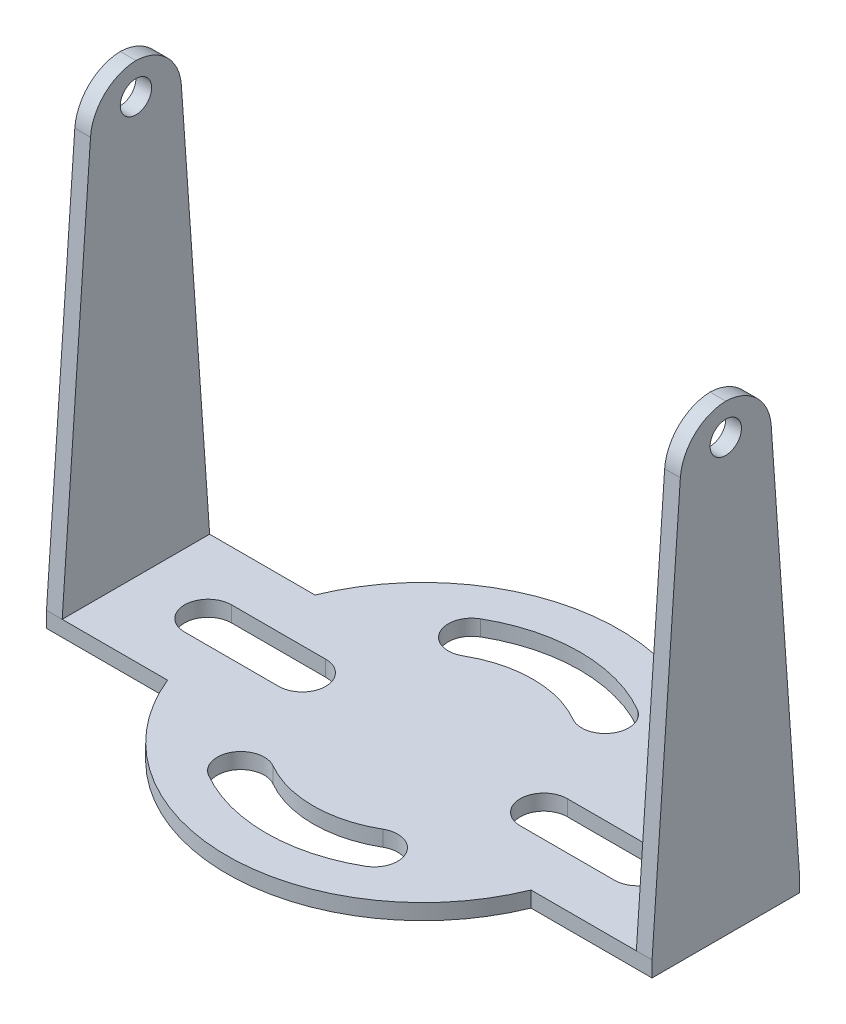
ISO-10303-21;
HEADER;
FILE_DESCRIPTION(('STEP AP214'),'2;1');
FILE_NAME('part.step','',(''),(''),'','','');
FILE_SCHEMA(('AUTOMOTIVE_DESIGN { 1 0 10303 214 1 1 1 1 }'));
ENDSEC;
DATA;
#1=APPLICATION_CONTEXT('core data for automotive mechanical design processes');
#2=APPLICATION_PROTOCOL_DEFINITION('international standard','automotive_design',2000,#1);
#3=PRODUCT_CONTEXT('',#1,'mechanical');
#4=PRODUCT('Part','Part','',(#3));
#5=PRODUCT_RELATED_PRODUCT_CATEGORY('part','',(#4));
#6=PRODUCT_DEFINITION_FORMATION('','',#4);
#7=PRODUCT_DEFINITION_CONTEXT('part definition',#1,'design');
#8=PRODUCT_DEFINITION('design','',#6,#7);
#9=PRODUCT_DEFINITION_SHAPE('','',#8);
#10=(LENGTH_UNIT() NAMED_UNIT(*) SI_UNIT(.MILLI.,.METRE.));
#11=(NAMED_UNIT(*) PLANE_ANGLE_UNIT() SI_UNIT($,.RADIAN.));
#12=(NAMED_UNIT(*) SI_UNIT($,.STERADIAN.) SOLID_ANGLE_UNIT());
#13=UNCERTAINTY_MEASURE_WITH_UNIT(LENGTH_MEASURE(1.E-05),#10,'distance_accuracy_value','');
#14=(GEOMETRIC_REPRESENTATION_CONTEXT(3) GLOBAL_UNCERTAINTY_ASSIGNED_CONTEXT((#13)) GLOBAL_UNIT_ASSIGNED_CONTEXT((#10,
#11,#12)) REPRESENTATION_CONTEXT('',''));
#15=CARTESIAN_POINT('',(0.,0.,0.));
#16=DIRECTION('',(0.,0.,1.));
#17=DIRECTION('',(1.,0.,0.));
#18=AXIS2_PLACEMENT_3D('',#15,#16,#17);
#19=CARTESIAN_POINT('',(19.3,1.,-4.7));
#20=DIRECTION('',(0.,0.,1.));
#21=DIRECTION('',(1.,0.,0.));
#22=AXIS2_PLACEMENT_3D('',#19,#20,#21);
#23=PLANE('',#22);
#24=DIRECTION('',(1.,0.,0.));
#25=VECTOR('',#24,1.);
#26=CARTESIAN_POINT('',(-19.3,0.999999999999998,-4.7));
#27=LINE('',#26,#25);
#28=CARTESIAN_POINT('',(18.3,0.999999999999998,-4.7));
#29=VERTEX_POINT('',#28);
#30=CARTESIAN_POINT('',(19.3,0.999999999999998,-4.7));
#31=VERTEX_POINT('',#30);
#32=EDGE_CURVE('E250',#29,#31,#27,.T.);
#33=ORIENTED_EDGE('',*,*,#32,.T.);
#34=DIRECTION('',(0.,-1.,0.));
#35=VECTOR('',#34,1.);
#36=CARTESIAN_POINT('',(19.3,1.,-4.7));
#37=LINE('',#36,#35);
#38=CARTESIAN_POINT('',(19.3,0.,-4.7));
#39=VERTEX_POINT('',#38);
#40=EDGE_CURVE('E262',#31,#39,#37,.T.);
#41=ORIENTED_EDGE('',*,*,#40,.T.);
#42=DIRECTION('',(-1.,0.,0.));
#43=VECTOR('',#42,1.);
#44=CARTESIAN_POINT('',(19.3,0.,-4.7));
#45=LINE('',#44,#43);
#46=CARTESIAN_POINT('',(11.5827457884562,0.,-4.7));
#47=VERTEX_POINT('',#46);
#48=EDGE_CURVE('E503',#39,#47,#45,.T.);
#49=ORIENTED_EDGE('',*,*,#48,.T.);
#50=DIRECTION('',(0.,1.,0.));
#51=VECTOR('',#50,1.);
#52=CARTESIAN_POINT('',(11.5827457884562,0.,-4.7));
#53=LINE('',#52,#51);
#54=CARTESIAN_POINT('',(11.5827457884562,1.,-4.7));
#55=VERTEX_POINT('',#54);
#56=EDGE_CURVE('E475',#47,#55,#53,.T.);
#57=ORIENTED_EDGE('',*,*,#56,.T.);
#58=DIRECTION('',(-1.,0.,0.));
#59=VECTOR('',#58,1.);
#60=CARTESIAN_POINT('',(19.3,1.,-4.7));
#61=LINE('',#60,#59);
#62=EDGE_CURVE('E266',#29,#55,#61,.T.);
#63=ORIENTED_EDGE('',*,*,#62,.F.);
#64=EDGE_LOOP('',(#33,#41,#49,#57,#63));
#65=FACE_BOUND('',#64,.T.);
#66=ADVANCED_FACE('F36',(#65),#23,.F.);
#67=CARTESIAN_POINT('',(-19.3,1.,4.7));
#68=DIRECTION('',(1.,0.,0.));
#69=DIRECTION('',(0.,0.,-1.));
#70=AXIS2_PLACEMENT_3D('',#67,#68,#69);
#71=PLANE('',#70);
#72=CARTESIAN_POINT('',(-19.3,27.5,0.));
#73=DIRECTION('',(1.,0.,0.));
#74=DIRECTION('',(0.,0.,-1.));
#75=AXIS2_PLACEMENT_3D('',#72,#73,#74);
#76=CIRCLE('',#75,1.);
#77=CARTESIAN_POINT('',(-19.3,27.5,-1.));
#78=VERTEX_POINT('',#77);
#79=EDGE_CURVE('E287',#78,#78,#76,.T.);
#80=ORIENTED_EDGE('',*,*,#79,.T.);
#81=EDGE_LOOP('',(#80));
#82=FACE_BOUND('',#81,.T.);
#83=CARTESIAN_POINT('',(-19.3,26.5,-0.0968515004550874));
#84=DIRECTION('',(1.,0.,0.));
#85=DIRECTION('',(0.,0.,-1.));
#86=AXIS2_PLACEMENT_3D('',#83,#84,#85);
#87=CIRCLE('',#86,3.);
#88=CARTESIAN_POINT('',(-19.3,26.7100098444422,2.89578878284616));
#89=VERTEX_POINT('',#88);
#90=CARTESIAN_POINT('',(-19.3,29.4984362235772,0.));
#91=VERTEX_POINT('',#90);
#92=EDGE_CURVE('E294',#89,#91,#87,.F.);
#93=ORIENTED_EDGE('',*,*,#92,.T.);
#94=CARTESIAN_POINT('',(-19.3,26.5,0.0968515004550873));
#95=DIRECTION('',(1.,0.,0.));
#96=DIRECTION('',(0.,0.,-1.));
#97=AXIS2_PLACEMENT_3D('',#94,#95,#96);
#98=CIRCLE('',#97,3.);
#99=CARTESIAN_POINT('',(-19.3,26.7100098444422,-2.89578878284616));
#100=VERTEX_POINT('',#99);
#101=EDGE_CURVE('E296',#91,#100,#98,.F.);
#102=ORIENTED_EDGE('',*,*,#101,.T.);
#103=DIRECTION('',(0.,0.997546761100416,0.0700032814807309));
#104=VECTOR('',#103,1.);
#105=CARTESIAN_POINT('',(-19.3,0.999999999999998,-4.7));
#106=LINE('',#105,#104);
#107=CARTESIAN_POINT('',(-19.3,0.999999999999998,-4.7));
#108=VERTEX_POINT('',#107);
#109=EDGE_CURVE('E257',#108,#100,#106,.T.);
#110=ORIENTED_EDGE('',*,*,#109,.F.);
#111=DIRECTION('',(0.,-1.,0.));
#112=VECTOR('',#111,1.);
#113=CARTESIAN_POINT('',(-19.3,1.,-4.7));
#114=LINE('',#113,#112);
#115=CARTESIAN_POINT('',(-19.3,0.,-4.7));
#116=VERTEX_POINT('',#115);
#117=EDGE_CURVE('E275',#108,#116,#114,.T.);
#118=ORIENTED_EDGE('',*,*,#117,.T.);
#119=DIRECTION('',(0.,0.,1.));
#120=VECTOR('',#119,1.);
#121=CARTESIAN_POINT('',(-19.3,0.,4.7));
#122=LINE('',#121,#120);
#123=CARTESIAN_POINT('',(-19.3,0.,4.7));
#124=VERTEX_POINT('',#123);
#125=EDGE_CURVE('E489',#116,#124,#122,.T.);
#126=ORIENTED_EDGE('',*,*,#125,.T.);
#127=DIRECTION('',(0.,-1.,0.));
#128=VECTOR('',#127,1.);
#129=CARTESIAN_POINT('',(-19.3,1.,4.7));
#130=LINE('',#129,#128);
#131=CARTESIAN_POINT('',(-19.3,0.999999999999998,4.7));
#132=VERTEX_POINT('',#131);
#133=EDGE_CURVE('E277',#132,#124,#130,.T.);
#134=ORIENTED_EDGE('',*,*,#133,.F.);
#135=DIRECTION('',(0.,0.997546761100416,-0.070003281480731));
#136=VECTOR('',#135,1.);
#137=CARTESIAN_POINT('',(-19.3,0.333108728943338,4.74679938744257));
#138=LINE('',#137,#136);
#139=EDGE_CURVE('E326',#132,#89,#138,.T.);
#140=ORIENTED_EDGE('',*,*,#139,.T.);
#141=EDGE_LOOP('',(#93,#102,#110,#118,#126,#134,#140));
#142=FACE_BOUND('',#141,.T.);
#143=ADVANCED_FACE('F522',(#82,#142),#71,.F.);
#144=CARTESIAN_POINT('',(19.3,1.,4.7));
#145=DIRECTION('',(-1.,0.,0.));
#146=DIRECTION('',(0.,0.,1.));
#147=AXIS2_PLACEMENT_3D('',#144,#145,#146);
#148=PLANE('',#147);
#149=CARTESIAN_POINT('',(19.3,27.5,0.));
#150=DIRECTION('',(1.,0.,0.));
#151=DIRECTION('',(0.,0.,-1.));
#152=AXIS2_PLACEMENT_3D('',#149,#150,#151);
#153=CIRCLE('',#152,1.);
#154=CARTESIAN_POINT('',(19.3,27.5,-1.));
#155=VERTEX_POINT('',#154);
#156=EDGE_CURVE('E308',#155,#155,#153,.T.);
#157=ORIENTED_EDGE('',*,*,#156,.F.);
#158=EDGE_LOOP('',(#157));
#159=FACE_BOUND('',#158,.T.);
#160=DIRECTION('',(0.,0.997546761100416,0.0700032814807309));
#161=VECTOR('',#160,1.);
#162=CARTESIAN_POINT('',(19.3,0.999999999999998,-4.7));
#163=LINE('',#162,#161);
#164=CARTESIAN_POINT('',(19.3,26.7100098444422,-2.89578878284616));
#165=VERTEX_POINT('',#164);
#166=EDGE_CURVE('E246',#31,#165,#163,.T.);
#167=ORIENTED_EDGE('',*,*,#166,.T.);
#168=CARTESIAN_POINT('',(19.3,26.5,0.0968515004550873));
#169=DIRECTION('',(-1.,0.,0.));
#170=DIRECTION('',(0.,0.,1.));
#171=AXIS2_PLACEMENT_3D('',#168,#169,#170);
#172=CIRCLE('',#171,3.);
#173=CARTESIAN_POINT('',(19.3,29.4984362235772,0.));
#174=VERTEX_POINT('',#173);
#175=EDGE_CURVE('E303',#165,#174,#172,.F.);
#176=ORIENTED_EDGE('',*,*,#175,.T.);
#177=CARTESIAN_POINT('',(19.3,26.5,-0.0968515004550874));
#178=DIRECTION('',(-1.,0.,0.));
#179=DIRECTION('',(0.,0.,1.));
#180=AXIS2_PLACEMENT_3D('',#177,#178,#179);
#181=CIRCLE('',#180,3.);
#182=CARTESIAN_POINT('',(19.3,26.7100098444422,2.89578878284616));
#183=VERTEX_POINT('',#182);
#184=EDGE_CURVE('E301',#174,#183,#181,.F.);
#185=ORIENTED_EDGE('',*,*,#184,.T.);
#186=DIRECTION('',(0.,0.997546761100416,-0.070003281480731));
#187=VECTOR('',#186,1.);
#188=CARTESIAN_POINT('',(19.3,0.333108728943338,4.74679938744257));
#189=LINE('',#188,#187);
#190=CARTESIAN_POINT('',(19.3,0.999999999999998,4.7));
#191=VERTEX_POINT('',#190);
#192=EDGE_CURVE('E321',#191,#183,#189,.T.);
#193=ORIENTED_EDGE('',*,*,#192,.F.);
#194=DIRECTION('',(0.,-1.,0.));
#195=VECTOR('',#194,1.);
#196=CARTESIAN_POINT('',(19.3,1.,4.7));
#197=LINE('',#196,#195);
#198=CARTESIAN_POINT('',(19.3,0.,4.7));
#199=VERTEX_POINT('',#198);
#200=EDGE_CURVE('E274',#191,#199,#197,.T.);
#201=ORIENTED_EDGE('',*,*,#200,.T.);
#202=DIRECTION('',(0.,0.,-1.));
#203=VECTOR('',#202,1.);
#204=CARTESIAN_POINT('',(19.3,0.,4.7));
#205=LINE('',#204,#203);
#206=EDGE_CURVE('E272',#199,#39,#205,.T.);
#207=ORIENTED_EDGE('',*,*,#206,.T.);
#208=ORIENTED_EDGE('',*,*,#40,.F.);
#209=EDGE_LOOP('',(#167,#176,#185,#193,#201,#207,#208));
#210=FACE_BOUND('',#209,.T.);
#211=ADVANCED_FACE('F270',(#159,#210),#148,.F.);
#212=CARTESIAN_POINT('',(-18.3,0.999999999999998,-4.7));
#213=VERTEX_POINT('',#212);
#214=EDGE_CURVE('E267',#108,#213,#27,.T.);
#215=ORIENTED_EDGE('',*,*,#214,.T.);
#216=CARTESIAN_POINT('',(-11.5827457884562,1.,-4.7));
#217=VERTEX_POINT('',#216);
#218=EDGE_CURVE('E493',#217,#213,#61,.T.);
#219=ORIENTED_EDGE('',*,*,#218,.F.);
#220=DIRECTION('',(0.,1.,0.));
#221=VECTOR('',#220,1.);
#222=CARTESIAN_POINT('',(-11.5827457884562,0.,-4.7));
#223=LINE('',#222,#221);
#224=CARTESIAN_POINT('',(-11.5827457884562,0.,-4.7));
#225=VERTEX_POINT('',#224);
#226=EDGE_CURVE('E457',#217,#225,#223,.F.);
#227=ORIENTED_EDGE('',*,*,#226,.T.);
#228=EDGE_CURVE('E502',#225,#116,#45,.T.);
#229=ORIENTED_EDGE('',*,*,#228,.T.);
#230=ORIENTED_EDGE('',*,*,#117,.F.);
#231=EDGE_LOOP('',(#215,#219,#227,#229,#230));
#232=FACE_BOUND('',#231,.T.);
#233=ADVANCED_FACE('F511',(#232),#23,.F.);
#234=CARTESIAN_POINT('',(-18.3,29.5,-4.7));
#235=DIRECTION('',(-1.,0.,0.));
#236=DIRECTION('',(0.,0.,1.));
#237=AXIS2_PLACEMENT_3D('',#234,#235,#236);
#238=PLANE('',#237);
#239=CARTESIAN_POINT('',(-18.3,27.5,0.));
#240=DIRECTION('',(-1.,0.,0.));
#241=DIRECTION('',(0.,0.,1.));
#242=AXIS2_PLACEMENT_3D('',#239,#240,#241);
#243=CIRCLE('',#242,1.);
#244=CARTESIAN_POINT('',(-18.3,27.5,1.));
#245=VERTEX_POINT('',#244);
#246=EDGE_CURVE('E268',#245,#245,#243,.T.);
#247=ORIENTED_EDGE('',*,*,#246,.T.);
#248=EDGE_LOOP('',(#247));
#249=FACE_BOUND('',#248,.T.);
#250=DIRECTION('',(0.,-0.997546761100416,-0.0700032814807309));
#251=VECTOR('',#250,1.);
#252=CARTESIAN_POINT('',(-18.3,29.360336906585,-2.70980091883614));
#253=LINE('',#252,#251);
#254=CARTESIAN_POINT('',(-18.3,26.7100098444422,-2.89578878284616));
#255=VERTEX_POINT('',#254);
#256=EDGE_CURVE('E327',#255,#213,#253,.T.);
#257=ORIENTED_EDGE('',*,*,#256,.F.);
#258=CARTESIAN_POINT('',(-18.3,26.5,0.0968515004550873));
#259=DIRECTION('',(-1.,0.,0.));
#260=DIRECTION('',(0.,0.,1.));
#261=AXIS2_PLACEMENT_3D('',#258,#259,#260);
#262=CIRCLE('',#261,3.);
#263=CARTESIAN_POINT('',(-18.3,29.4984362235772,0.));
#264=VERTEX_POINT('',#263);
#265=EDGE_CURVE('E292',#255,#264,#262,.F.);
#266=ORIENTED_EDGE('',*,*,#265,.T.);
#267=CARTESIAN_POINT('',(-18.3,26.5,-0.0968515004550874));
#268=DIRECTION('',(-1.,0.,0.));
#269=DIRECTION('',(0.,0.,1.));
#270=AXIS2_PLACEMENT_3D('',#267,#268,#269);
#271=CIRCLE('',#270,3.);
#272=CARTESIAN_POINT('',(-18.3,26.7100098444422,2.89578878284616));
#273=VERTEX_POINT('',#272);
#274=EDGE_CURVE('E290',#264,#273,#271,.F.);
#275=ORIENTED_EDGE('',*,*,#274,.T.);
#276=DIRECTION('',(0.,-0.997546761100416,0.0700032814807309));
#277=VECTOR('',#276,1.);
#278=CARTESIAN_POINT('',(-18.3,30.0167534456355,2.66373660030628));
#279=LINE('',#278,#277);
#280=CARTESIAN_POINT('',(-18.3,0.999999999999998,4.7));
#281=VERTEX_POINT('',#280);
#282=EDGE_CURVE('E338',#273,#281,#279,.T.);
#283=ORIENTED_EDGE('',*,*,#282,.T.);
#284=DIRECTION('',(0.,0.,-1.));
#285=VECTOR('',#284,1.);
#286=CARTESIAN_POINT('',(-18.3,1.,-4.7));
#287=LINE('',#286,#285);
#288=EDGE_CURVE('E486',#281,#213,#287,.T.);
#289=ORIENTED_EDGE('',*,*,#288,.T.);
#290=EDGE_LOOP('',(#257,#266,#275,#283,#289));
#291=FACE_BOUND('',#290,.T.);
#292=ADVANCED_FACE('F547',(#249,#291),#238,.F.);
#293=CARTESIAN_POINT('',(18.3,29.5,-4.7));
#294=DIRECTION('',(1.,0.,0.));
#295=DIRECTION('',(0.,0.,-1.));
#296=AXIS2_PLACEMENT_3D('',#293,#294,#295);
#297=PLANE('',#296);
#298=CARTESIAN_POINT('',(18.3,27.5,0.));
#299=DIRECTION('',(1.,0.,0.));
#300=DIRECTION('',(0.,0.,-1.));
#301=AXIS2_PLACEMENT_3D('',#298,#299,#300);
#302=CIRCLE('',#301,1.);
#303=CARTESIAN_POINT('',(18.3,27.5,-1.));
#304=VERTEX_POINT('',#303);
#305=EDGE_CURVE('E284',#304,#304,#302,.T.);
#306=ORIENTED_EDGE('',*,*,#305,.T.);
#307=EDGE_LOOP('',(#306));
#308=FACE_BOUND('',#307,.T.);
#309=CARTESIAN_POINT('',(18.3,26.5,-0.0968515004550874));
#310=DIRECTION('',(1.,0.,0.));
#311=DIRECTION('',(0.,0.,-1.));
#312=AXIS2_PLACEMENT_3D('',#309,#310,#311);
#313=CIRCLE('',#312,3.);
#314=CARTESIAN_POINT('',(18.3,26.7100098444422,2.89578878284616));
#315=VERTEX_POINT('',#314);
#316=CARTESIAN_POINT('',(18.3,29.4984362235772,0.));
#317=VERTEX_POINT('',#316);
#318=EDGE_CURVE('E53',#315,#317,#313,.F.);
#319=ORIENTED_EDGE('',*,*,#318,.T.);
#320=CARTESIAN_POINT('',(18.3,26.5,0.0968515004550873));
#321=DIRECTION('',(1.,0.,0.));
#322=DIRECTION('',(0.,0.,-1.));
#323=AXIS2_PLACEMENT_3D('',#320,#321,#322);
#324=CIRCLE('',#323,3.);
#325=CARTESIAN_POINT('',(18.3,26.7100098444422,-2.89578878284616));
#326=VERTEX_POINT('',#325);
#327=EDGE_CURVE('E45',#317,#326,#324,.F.);
#328=ORIENTED_EDGE('',*,*,#327,.T.);
#329=DIRECTION('',(0.,0.997546761100416,0.0700032814807309));
#330=VECTOR('',#329,1.);
#331=CARTESIAN_POINT('',(18.3,29.360336906585,-2.70980091883614));
#332=LINE('',#331,#330);
#333=EDGE_CURVE('E256',#29,#326,#332,.T.);
#334=ORIENTED_EDGE('',*,*,#333,.F.);
#335=DIRECTION('',(0.,0.,1.));
#336=VECTOR('',#335,1.);
#337=CARTESIAN_POINT('',(18.3,1.,-4.7));
#338=LINE('',#337,#336);
#339=CARTESIAN_POINT('',(18.3,0.999999999999998,4.7));
#340=VERTEX_POINT('',#339);
#341=EDGE_CURVE('E483',#29,#340,#338,.T.);
#342=ORIENTED_EDGE('',*,*,#341,.T.);
#343=DIRECTION('',(0.,0.997546761100416,-0.0700032814807309));
#344=VECTOR('',#343,1.);
#345=CARTESIAN_POINT('',(18.3,30.0167534456355,2.66373660030628));
#346=LINE('',#345,#344);
#347=EDGE_CURVE('E336',#340,#315,#346,.T.);
#348=ORIENTED_EDGE('',*,*,#347,.T.);
#349=EDGE_LOOP('',(#319,#328,#334,#342,#348));
#350=FACE_BOUND('',#349,.T.);
#351=ADVANCED_FACE('F530',(#308,#350),#297,.F.);
#352=CARTESIAN_POINT('',(19.3,1.,4.7));
#353=DIRECTION('',(0.,0.,-1.));
#354=DIRECTION('',(-1.,0.,0.));
#355=AXIS2_PLACEMENT_3D('',#352,#353,#354);
#356=PLANE('',#355);
#357=DIRECTION('',(1.,0.,0.));
#358=VECTOR('',#357,1.);
#359=CARTESIAN_POINT('',(19.3,1.,4.7));
#360=LINE('',#359,#358);
#361=CARTESIAN_POINT('',(-11.5827457884562,1.,4.7));
#362=VERTEX_POINT('',#361);
#363=EDGE_CURVE('E490',#281,#362,#360,.T.);
#364=ORIENTED_EDGE('',*,*,#363,.F.);
#365=DIRECTION('',(1.,0.,0.));
#366=VECTOR('',#365,1.);
#367=CARTESIAN_POINT('',(-19.3,0.999999999999998,4.7));
#368=LINE('',#367,#366);
#369=EDGE_CURVE('E333',#132,#281,#368,.T.);
#370=ORIENTED_EDGE('',*,*,#369,.F.);
#371=ORIENTED_EDGE('',*,*,#133,.T.);
#372=DIRECTION('',(1.,0.,0.));
#373=VECTOR('',#372,1.);
#374=CARTESIAN_POINT('',(19.3,0.,4.7));
#375=LINE('',#374,#373);
#376=CARTESIAN_POINT('',(-11.5827457884562,0.,4.7));
#377=VERTEX_POINT('',#376);
#378=EDGE_CURVE('E499',#124,#377,#375,.T.);
#379=ORIENTED_EDGE('',*,*,#378,.T.);
#380=DIRECTION('',(0.,1.,0.));
#381=VECTOR('',#380,1.);
#382=CARTESIAN_POINT('',(-11.5827457884562,0.,4.7));
#383=LINE('',#382,#381);
#384=EDGE_CURVE('E480',#377,#362,#383,.T.);
#385=ORIENTED_EDGE('',*,*,#384,.T.);
#386=EDGE_LOOP('',(#364,#370,#371,#379,#385));
#387=FACE_BOUND('',#386,.T.);
#388=ADVANCED_FACE('F555',(#387),#356,.F.);
#389=CARTESIAN_POINT('',(0.,1.,0.));
#390=DIRECTION('',(0.,1.,0.));
#391=DIRECTION('',(0.,0.,1.));
#392=AXIS2_PLACEMENT_3D('',#389,#390,#391);
#393=PLANE('',#392);
#394=CARTESIAN_POINT('',(0.,1.,0.));
#395=DIRECTION('',(0.,1.,0.));
#396=DIRECTION('',(0.,0.,1.));
#397=AXIS2_PLACEMENT_3D('',#394,#395,#396);
#398=CIRCLE('',#397,12.5);
#399=EDGE_CURVE('E443',#55,#217,#398,.T.);
#400=ORIENTED_EDGE('',*,*,#399,.T.);
#401=ORIENTED_EDGE('',*,*,#218,.T.);
#402=ORIENTED_EDGE('',*,*,#288,.F.);
#403=ORIENTED_EDGE('',*,*,#363,.T.);
#404=CARTESIAN_POINT('',(11.5827457884562,1.,4.7));
#405=VERTEX_POINT('',#404);
#406=EDGE_CURVE('E441',#362,#405,#398,.T.);
#407=ORIENTED_EDGE('',*,*,#406,.T.);
#408=EDGE_CURVE('E494',#405,#340,#360,.T.);
#409=ORIENTED_EDGE('',*,*,#408,.T.);
#410=ORIENTED_EDGE('',*,*,#341,.F.);
#411=ORIENTED_EDGE('',*,*,#62,.T.);
#412=EDGE_LOOP('',(#400,#401,#402,#403,#407,#409,#410,#411));
#413=FACE_BOUND('',#412,.T.);
#414=CARTESIAN_POINT('',(4.24999999999996,1.,-7.36121593216775));
#415=DIRECTION('',(0.,1.,0.));
#416=DIRECTION('',(0.,0.,1.));
#417=AXIS2_PLACEMENT_3D('',#414,#415,#416);
#418=CIRCLE('',#417,1.5);
#419=CARTESIAN_POINT('',(3.49999999999997,1.,-6.06217782649109));
#420=VERTEX_POINT('',#419);
#421=CARTESIAN_POINT('',(4.99999999999995,1.,-8.66025403784442));
#422=VERTEX_POINT('',#421);
#423=EDGE_CURVE('E398',#420,#422,#418,.T.);
#424=ORIENTED_EDGE('',*,*,#423,.F.);
#425=CARTESIAN_POINT('',(0.,1.,0.));
#426=DIRECTION('',(0.,1.,0.));
#427=DIRECTION('',(0.,0.,1.));
#428=AXIS2_PLACEMENT_3D('',#425,#426,#427);
#429=CIRCLE('',#428,7.);
#430=CARTESIAN_POINT('',(-3.49999999999996,1.,-6.06217782649109));
#431=VERTEX_POINT('',#430);
#432=EDGE_CURVE('E433',#420,#431,#429,.T.);
#433=ORIENTED_EDGE('',*,*,#432,.T.);
#434=CARTESIAN_POINT('',(-4.24999999999996,1.,-7.36121593216775));
#435=DIRECTION('',(0.,1.,0.));
#436=DIRECTION('',(0.,0.,1.));
#437=AXIS2_PLACEMENT_3D('',#434,#435,#436);
#438=CIRCLE('',#437,1.5);
#439=CARTESIAN_POINT('',(-4.99999999999995,1.,-8.66025403784441));
#440=VERTEX_POINT('',#439);
#441=EDGE_CURVE('E436',#440,#431,#438,.T.);
#442=ORIENTED_EDGE('',*,*,#441,.F.);
#443=CARTESIAN_POINT('',(0.,1.,0.));
#444=DIRECTION('',(0.,1.,0.));
#445=DIRECTION('',(0.,0.,1.));
#446=AXIS2_PLACEMENT_3D('',#443,#444,#445);
#447=CIRCLE('',#446,10.);
#448=EDGE_CURVE('E439',#422,#440,#447,.T.);
#449=ORIENTED_EDGE('',*,*,#448,.F.);
#450=EDGE_LOOP('',(#424,#433,#442,#449));
#451=FACE_BOUND('',#450,.T.);
#452=CARTESIAN_POINT('',(0.,1.,0.));
#453=DIRECTION('',(0.,1.,0.));
#454=DIRECTION('',(0.,0.,1.));
#455=AXIS2_PLACEMENT_3D('',#452,#453,#454);
#456=CIRCLE('',#455,10.);
#457=CARTESIAN_POINT('',(4.99999999999995,1.,8.66025403784442));
#458=VERTEX_POINT('',#457);
#459=CARTESIAN_POINT('',(-4.99999999999995,1.,8.66025403784441));
#460=VERTEX_POINT('',#459);
#461=EDGE_CURVE('E444',#458,#460,#456,.F.);
#462=ORIENTED_EDGE('',*,*,#461,.T.);
#463=CARTESIAN_POINT('',(-4.24999999999996,1.,7.36121593216775));
#464=DIRECTION('',(0.,1.,0.));
#465=DIRECTION('',(0.,0.,1.));
#466=AXIS2_PLACEMENT_3D('',#463,#464,#465);
#467=CIRCLE('',#466,1.5);
#468=CARTESIAN_POINT('',(-3.49999999999996,1.,6.06217782649109));
#469=VERTEX_POINT('',#468);
#470=EDGE_CURVE('E447',#460,#469,#467,.F.);
#471=ORIENTED_EDGE('',*,*,#470,.T.);
#472=CARTESIAN_POINT('',(0.,1.,0.));
#473=DIRECTION('',(0.,1.,0.));
#474=DIRECTION('',(0.,0.,1.));
#475=AXIS2_PLACEMENT_3D('',#472,#473,#474);
#476=CIRCLE('',#475,7.);
#477=CARTESIAN_POINT('',(3.49999999999996,1.,6.06217782649109));
#478=VERTEX_POINT('',#477);
#479=EDGE_CURVE('E450',#478,#469,#476,.F.);
#480=ORIENTED_EDGE('',*,*,#479,.F.);
#481=CARTESIAN_POINT('',(4.24999999999996,1.,7.36121593216775));
#482=DIRECTION('',(0.,1.,0.));
#483=DIRECTION('',(0.,0.,1.));
#484=AXIS2_PLACEMENT_3D('',#481,#482,#483);
#485=CIRCLE('',#484,1.5);
#486=EDGE_CURVE('E409',#478,#458,#485,.F.);
#487=ORIENTED_EDGE('',*,*,#486,.T.);
#488=EDGE_LOOP('',(#462,#471,#480,#487));
#489=FACE_BOUND('',#488,.T.);
#490=CARTESIAN_POINT('',(13.7,1.,0.));
#491=DIRECTION('',(0.,1.,0.));
#492=DIRECTION('',(0.,0.,1.));
#493=AXIS2_PLACEMENT_3D('',#490,#491,#492);
#494=CIRCLE('',#493,1.5);
#495=CARTESIAN_POINT('',(13.7,1.,1.5));
#496=VERTEX_POINT('',#495);
#497=CARTESIAN_POINT('',(13.7,1.,-1.5));
#498=VERTEX_POINT('',#497);
#499=EDGE_CURVE('E366',#496,#498,#494,.T.);
#500=ORIENTED_EDGE('',*,*,#499,.F.);
#501=DIRECTION('',(1.,0.,0.));
#502=VECTOR('',#501,1.);
#503=CARTESIAN_POINT('',(13.7,1.,1.5));
#504=LINE('',#503,#502);
#505=CARTESIAN_POINT('',(7.7,1.,1.5));
#506=VERTEX_POINT('',#505);
#507=EDGE_CURVE('E377',#506,#496,#504,.T.);
#508=ORIENTED_EDGE('',*,*,#507,.F.);
#509=CARTESIAN_POINT('',(7.7,1.,0.));
#510=DIRECTION('',(0.,1.,0.));
#511=DIRECTION('',(0.,0.,1.));
#512=AXIS2_PLACEMENT_3D('',#509,#510,#511);
#513=CIRCLE('',#512,1.5);
#514=CARTESIAN_POINT('',(7.7,1.,-1.5));
#515=VERTEX_POINT('',#514);
#516=EDGE_CURVE('E391',#515,#506,#513,.T.);
#517=ORIENTED_EDGE('',*,*,#516,.F.);
#518=DIRECTION('',(-1.,0.,0.));
#519=VECTOR('',#518,1.);
#520=CARTESIAN_POINT('',(13.7,1.,-1.5));
#521=LINE('',#520,#519);
#522=EDGE_CURVE('E388',#498,#515,#521,.T.);
#523=ORIENTED_EDGE('',*,*,#522,.F.);
#524=EDGE_LOOP('',(#500,#508,#517,#523));
#525=FACE_BOUND('',#524,.T.);
#526=CARTESIAN_POINT('',(-13.7,1.,0.));
#527=DIRECTION('',(0.,1.,0.));
#528=DIRECTION('',(0.,0.,-1.));
#529=AXIS2_PLACEMENT_3D('',#526,#527,#528);
#530=CIRCLE('',#529,1.5);
#531=CARTESIAN_POINT('',(-13.7,1.,-1.49999999999999));
#532=VERTEX_POINT('',#531);
#533=CARTESIAN_POINT('',(-13.7,1.,1.5));
#534=VERTEX_POINT('',#533);
#535=EDGE_CURVE('E340',#532,#534,#530,.T.);
#536=ORIENTED_EDGE('',*,*,#535,.F.);
#537=DIRECTION('',(-1.,0.,0.));
#538=VECTOR('',#537,1.);
#539=CARTESIAN_POINT('',(-13.7,1.,-1.49999999999999));
#540=LINE('',#539,#538);
#541=CARTESIAN_POINT('',(-7.7,1.,-1.5));
#542=VERTEX_POINT('',#541);
#543=EDGE_CURVE('E345',#542,#532,#540,.T.);
#544=ORIENTED_EDGE('',*,*,#543,.F.);
#545=CARTESIAN_POINT('',(-7.7,1.,0.));
#546=DIRECTION('',(0.,1.,0.));
#547=DIRECTION('',(0.,0.,-1.));
#548=AXIS2_PLACEMENT_3D('',#545,#546,#547);
#549=CIRCLE('',#548,1.5);
#550=CARTESIAN_POINT('',(-7.7,1.,1.5));
#551=VERTEX_POINT('',#550);
#552=EDGE_CURVE('E359',#551,#542,#549,.T.);
#553=ORIENTED_EDGE('',*,*,#552,.F.);
#554=DIRECTION('',(1.,0.,0.));
#555=VECTOR('',#554,1.);
#556=CARTESIAN_POINT('',(-13.7,1.,1.5));
#557=LINE('',#556,#555);
#558=EDGE_CURVE('E356',#534,#551,#557,.T.);
#559=ORIENTED_EDGE('',*,*,#558,.F.);
#560=EDGE_LOOP('',(#536,#544,#553,#559));
#561=FACE_BOUND('',#560,.T.);
#562=ADVANCED_FACE('F532',(#413,#451,#489,#525,#561),#393,.T.);
#563=ORIENTED_EDGE('',*,*,#200,.F.);
#564=EDGE_CURVE('E325',#340,#191,#368,.T.);
#565=ORIENTED_EDGE('',*,*,#564,.F.);
#566=ORIENTED_EDGE('',*,*,#408,.F.);
#567=DIRECTION('',(0.,1.,0.));
#568=VECTOR('',#567,1.);
#569=CARTESIAN_POINT('',(11.5827457884562,0.,4.7));
#570=LINE('',#569,#568);
#571=CARTESIAN_POINT('',(11.5827457884562,0.,4.7));
#572=VERTEX_POINT('',#571);
#573=EDGE_CURVE('E477',#405,#572,#570,.F.);
#574=ORIENTED_EDGE('',*,*,#573,.T.);
#575=EDGE_CURVE('E498',#572,#199,#375,.T.);
#576=ORIENTED_EDGE('',*,*,#575,.T.);
#577=EDGE_LOOP('',(#563,#565,#566,#574,#576));
#578=FACE_BOUND('',#577,.T.);
#579=ADVANCED_FACE('F537',(#578),#356,.F.);
#580=CARTESIAN_POINT('',(0.,0.,0.));
#581=DIRECTION('',(0.,1.,0.));
#582=DIRECTION('',(0.,0.,1.));
#583=AXIS2_PLACEMENT_3D('',#580,#581,#582);
#584=PLANE('',#583);
#585=DIRECTION('',(-1.,0.,0.));
#586=VECTOR('',#585,1.);
#587=CARTESIAN_POINT('',(-13.7,0.,-1.49999999999999));
#588=LINE('',#587,#586);
#589=CARTESIAN_POINT('',(-7.7,0.,-1.5));
#590=VERTEX_POINT('',#589);
#591=CARTESIAN_POINT('',(-13.7,0.,-1.49999999999999));
#592=VERTEX_POINT('',#591);
#593=EDGE_CURVE('E351',#590,#592,#588,.T.);
#594=ORIENTED_EDGE('',*,*,#593,.T.);
#595=CARTESIAN_POINT('',(-13.7,0.,0.));
#596=DIRECTION('',(0.,1.,0.));
#597=DIRECTION('',(0.,0.,-1.));
#598=AXIS2_PLACEMENT_3D('',#595,#596,#597);
#599=CIRCLE('',#598,1.5);
#600=CARTESIAN_POINT('',(-13.7,0.,1.5));
#601=VERTEX_POINT('',#600);
#602=EDGE_CURVE('E341',#592,#601,#599,.T.);
#603=ORIENTED_EDGE('',*,*,#602,.T.);
#604=DIRECTION('',(1.,0.,0.));
#605=VECTOR('',#604,1.);
#606=CARTESIAN_POINT('',(-13.7,0.,1.5));
#607=LINE('',#606,#605);
#608=CARTESIAN_POINT('',(-7.7,0.,1.5));
#609=VERTEX_POINT('',#608);
#610=EDGE_CURVE('E344',#601,#609,#607,.T.);
#611=ORIENTED_EDGE('',*,*,#610,.T.);
#612=CARTESIAN_POINT('',(-7.7,0.,0.));
#613=DIRECTION('',(0.,1.,0.));
#614=DIRECTION('',(0.,0.,-1.));
#615=AXIS2_PLACEMENT_3D('',#612,#613,#614);
#616=CIRCLE('',#615,1.5);
#617=EDGE_CURVE('E348',#609,#590,#616,.T.);
#618=ORIENTED_EDGE('',*,*,#617,.T.);
#619=EDGE_LOOP('',(#594,#603,#611,#618));
#620=FACE_BOUND('',#619,.T.);
#621=DIRECTION('',(1.,0.,0.));
#622=VECTOR('',#621,1.);
#623=CARTESIAN_POINT('',(13.7,0.,1.5));
#624=LINE('',#623,#622);
#625=CARTESIAN_POINT('',(7.7,0.,1.5));
#626=VERTEX_POINT('',#625);
#627=CARTESIAN_POINT('',(13.7,0.,1.5));
#628=VERTEX_POINT('',#627);
#629=EDGE_CURVE('E383',#626,#628,#624,.T.);
#630=ORIENTED_EDGE('',*,*,#629,.T.);
#631=CARTESIAN_POINT('',(13.7,0.,0.));
#632=DIRECTION('',(0.,1.,0.));
#633=DIRECTION('',(0.,0.,1.));
#634=AXIS2_PLACEMENT_3D('',#631,#632,#633);
#635=CIRCLE('',#634,1.5);
#636=CARTESIAN_POINT('',(13.7,0.,-1.5));
#637=VERTEX_POINT('',#636);
#638=EDGE_CURVE('E373',#628,#637,#635,.T.);
#639=ORIENTED_EDGE('',*,*,#638,.T.);
#640=DIRECTION('',(-1.,0.,0.));
#641=VECTOR('',#640,1.);
#642=CARTESIAN_POINT('',(13.7,0.,-1.5));
#643=LINE('',#642,#641);
#644=CARTESIAN_POINT('',(7.7,0.,-1.5));
#645=VERTEX_POINT('',#644);
#646=EDGE_CURVE('E376',#637,#645,#643,.T.);
#647=ORIENTED_EDGE('',*,*,#646,.T.);
#648=CARTESIAN_POINT('',(7.7,0.,0.));
#649=DIRECTION('',(0.,1.,0.));
#650=DIRECTION('',(0.,0.,1.));
#651=AXIS2_PLACEMENT_3D('',#648,#649,#650);
#652=CIRCLE('',#651,1.5);
#653=EDGE_CURVE('E380',#645,#626,#652,.T.);
#654=ORIENTED_EDGE('',*,*,#653,.T.);
#655=EDGE_LOOP('',(#630,#639,#647,#654));
#656=FACE_BOUND('',#655,.T.);
#657=ORIENTED_EDGE('',*,*,#228,.F.);
#658=CARTESIAN_POINT('',(0.,0.,0.));
#659=DIRECTION('',(0.,1.,0.));
#660=DIRECTION('',(0.,0.,1.));
#661=AXIS2_PLACEMENT_3D('',#658,#659,#660);
#662=CIRCLE('',#661,12.5);
#663=EDGE_CURVE('E418',#47,#225,#662,.T.);
#664=ORIENTED_EDGE('',*,*,#663,.F.);
#665=ORIENTED_EDGE('',*,*,#48,.F.);
#666=ORIENTED_EDGE('',*,*,#206,.F.);
#667=ORIENTED_EDGE('',*,*,#575,.F.);
#668=EDGE_CURVE('E416',#377,#572,#662,.T.);
#669=ORIENTED_EDGE('',*,*,#668,.F.);
#670=ORIENTED_EDGE('',*,*,#378,.F.);
#671=ORIENTED_EDGE('',*,*,#125,.F.);
#672=EDGE_LOOP('',(#657,#664,#665,#666,#667,#669,#670,#671));
#673=FACE_BOUND('',#672,.T.);
#674=CARTESIAN_POINT('',(4.24999999999996,0.,-7.36121593216775));
#675=DIRECTION('',(0.,1.,0.));
#676=DIRECTION('',(0.,0.,1.));
#677=AXIS2_PLACEMENT_3D('',#674,#675,#676);
#678=CIRCLE('',#677,1.5);
#679=CARTESIAN_POINT('',(3.49999999999997,0.,-6.06217782649109));
#680=VERTEX_POINT('',#679);
#681=CARTESIAN_POINT('',(4.99999999999995,0.,-8.66025403784442));
#682=VERTEX_POINT('',#681);
#683=EDGE_CURVE('E405',#680,#682,#678,.T.);
#684=ORIENTED_EDGE('',*,*,#683,.T.);
#685=CARTESIAN_POINT('',(0.,0.,0.));
#686=DIRECTION('',(0.,1.,0.));
#687=DIRECTION('',(0.,0.,1.));
#688=AXIS2_PLACEMENT_3D('',#685,#686,#687);
#689=CIRCLE('',#688,10.);
#690=CARTESIAN_POINT('',(-4.99999999999995,0.,-8.66025403784441));
#691=VERTEX_POINT('',#690);
#692=EDGE_CURVE('E414',#682,#691,#689,.T.);
#693=ORIENTED_EDGE('',*,*,#692,.T.);
#694=CARTESIAN_POINT('',(-4.24999999999996,0.,-7.36121593216775));
#695=DIRECTION('',(0.,1.,0.));
#696=DIRECTION('',(0.,0.,1.));
#697=AXIS2_PLACEMENT_3D('',#694,#695,#696);
#698=CIRCLE('',#697,1.5);
#699=CARTESIAN_POINT('',(-3.49999999999996,0.,-6.06217782649109));
#700=VERTEX_POINT('',#699);
#701=EDGE_CURVE('E412',#691,#700,#698,.T.);
#702=ORIENTED_EDGE('',*,*,#701,.T.);
#703=CARTESIAN_POINT('',(0.,0.,0.));
#704=DIRECTION('',(0.,1.,0.));
#705=DIRECTION('',(0.,0.,1.));
#706=AXIS2_PLACEMENT_3D('',#703,#704,#705);
#707=CIRCLE('',#706,7.);
#708=EDGE_CURVE('E408',#680,#700,#707,.T.);
#709=ORIENTED_EDGE('',*,*,#708,.F.);
#710=EDGE_LOOP('',(#684,#693,#702,#709));
#711=FACE_BOUND('',#710,.T.);
#712=CARTESIAN_POINT('',(0.,0.,0.));
#713=DIRECTION('',(0.,1.,0.));
#714=DIRECTION('',(0.,0.,1.));
#715=AXIS2_PLACEMENT_3D('',#712,#713,#714);
#716=CIRCLE('',#715,10.);
#717=CARTESIAN_POINT('',(4.99999999999995,0.,8.66025403784442));
#718=VERTEX_POINT('',#717);
#719=CARTESIAN_POINT('',(-4.99999999999995,0.,8.66025403784441));
#720=VERTEX_POINT('',#719);
#721=EDGE_CURVE('E419',#718,#720,#716,.F.);
#722=ORIENTED_EDGE('',*,*,#721,.F.);
#723=CARTESIAN_POINT('',(4.24999999999996,0.,7.36121593216775));
#724=DIRECTION('',(0.,1.,0.));
#725=DIRECTION('',(0.,0.,1.));
#726=AXIS2_PLACEMENT_3D('',#723,#724,#725);
#727=CIRCLE('',#726,1.5);
#728=CARTESIAN_POINT('',(3.49999999999996,0.,6.06217782649109));
#729=VERTEX_POINT('',#728);
#730=EDGE_CURVE('E427',#729,#718,#727,.F.);
#731=ORIENTED_EDGE('',*,*,#730,.F.);
#732=CARTESIAN_POINT('',(0.,0.,0.));
#733=DIRECTION('',(0.,1.,0.));
#734=DIRECTION('',(0.,0.,1.));
#735=AXIS2_PLACEMENT_3D('',#732,#733,#734);
#736=CIRCLE('',#735,7.);
#737=CARTESIAN_POINT('',(-3.49999999999996,0.,6.06217782649109));
#738=VERTEX_POINT('',#737);
#739=EDGE_CURVE('E425',#729,#738,#736,.F.);
#740=ORIENTED_EDGE('',*,*,#739,.T.);
#741=CARTESIAN_POINT('',(-4.24999999999996,0.,7.36121593216775));
#742=DIRECTION('',(0.,1.,0.));
#743=DIRECTION('',(0.,0.,1.));
#744=AXIS2_PLACEMENT_3D('',#741,#742,#743);
#745=CIRCLE('',#744,1.5);
#746=EDGE_CURVE('E422',#720,#738,#745,.F.);
#747=ORIENTED_EDGE('',*,*,#746,.F.);
#748=EDGE_LOOP('',(#722,#731,#740,#747));
#749=FACE_BOUND('',#748,.T.);
#750=ADVANCED_FACE('F517',(#620,#656,#673,#711,#749),#584,.F.);
#751=CARTESIAN_POINT('',(0.,0.,0.));
#752=DIRECTION('',(0.,1.,0.));
#753=DIRECTION('',(0.,0.,1.));
#754=AXIS2_PLACEMENT_3D('',#751,#752,#753);
#755=CYLINDRICAL_SURFACE('',#754,10.);
#756=ORIENTED_EDGE('',*,*,#448,.T.);
#757=DIRECTION('',(0.,1.,0.));
#758=VECTOR('',#757,1.);
#759=CARTESIAN_POINT('',(-4.99999999999995,0.,-8.66025403784441));
#760=LINE('',#759,#758);
#761=EDGE_CURVE('E467',#691,#440,#760,.T.);
#762=ORIENTED_EDGE('',*,*,#761,.F.);
#763=ORIENTED_EDGE('',*,*,#692,.F.);
#764=DIRECTION('',(0.,1.,0.));
#765=VECTOR('',#764,1.);
#766=CARTESIAN_POINT('',(4.99999999999995,0.,-8.66025403784442));
#767=LINE('',#766,#765);
#768=EDGE_CURVE('E464',#682,#422,#767,.T.);
#769=ORIENTED_EDGE('',*,*,#768,.T.);
#770=EDGE_LOOP('',(#756,#762,#763,#769));
#771=FACE_BOUND('',#770,.T.);
#772=ADVANCED_FACE('F785',(#771),#755,.F.);
#773=CARTESIAN_POINT('',(-4.24999999999996,0.,-7.36121593216775));
#774=DIRECTION('',(0.,1.,0.));
#775=DIRECTION('',(0.,0.,1.));
#776=AXIS2_PLACEMENT_3D('',#773,#774,#775);
#777=CYLINDRICAL_SURFACE('',#776,1.5);
#778=ORIENTED_EDGE('',*,*,#441,.T.);
#779=DIRECTION('',(0.,1.,0.));
#780=VECTOR('',#779,1.);
#781=CARTESIAN_POINT('',(-3.49999999999996,0.,-6.06217782649109));
#782=LINE('',#781,#780);
#783=EDGE_CURVE('E470',#700,#431,#782,.T.);
#784=ORIENTED_EDGE('',*,*,#783,.F.);
#785=ORIENTED_EDGE('',*,*,#701,.F.);
#786=ORIENTED_EDGE('',*,*,#761,.T.);
#787=EDGE_LOOP('',(#778,#784,#785,#786));
#788=FACE_BOUND('',#787,.T.);
#789=ADVANCED_FACE('F775',(#788),#777,.F.);
#790=CARTESIAN_POINT('',(0.,0.,0.));
#791=DIRECTION('',(0.,1.,0.));
#792=DIRECTION('',(0.,0.,1.));
#793=AXIS2_PLACEMENT_3D('',#790,#791,#792);
#794=CYLINDRICAL_SURFACE('',#793,7.);
#795=ORIENTED_EDGE('',*,*,#432,.F.);
#796=DIRECTION('',(0.,1.,0.));
#797=VECTOR('',#796,1.);
#798=CARTESIAN_POINT('',(3.49999999999997,0.,-6.06217782649109));
#799=LINE('',#798,#797);
#800=EDGE_CURVE('E430',#680,#420,#799,.T.);
#801=ORIENTED_EDGE('',*,*,#800,.F.);
#802=ORIENTED_EDGE('',*,*,#708,.T.);
#803=ORIENTED_EDGE('',*,*,#783,.T.);
#804=EDGE_LOOP('',(#795,#801,#802,#803));
#805=FACE_BOUND('',#804,.T.);
#806=ADVANCED_FACE('F765',(#805),#794,.T.);
#807=CARTESIAN_POINT('',(4.24999999999996,0.,-7.36121593216775));
#808=DIRECTION('',(0.,1.,0.));
#809=DIRECTION('',(0.,0.,1.));
#810=AXIS2_PLACEMENT_3D('',#807,#808,#809);
#811=CYLINDRICAL_SURFACE('',#810,1.5);
#812=ORIENTED_EDGE('',*,*,#423,.T.);
#813=ORIENTED_EDGE('',*,*,#768,.F.);
#814=ORIENTED_EDGE('',*,*,#683,.F.);
#815=ORIENTED_EDGE('',*,*,#800,.T.);
#816=EDGE_LOOP('',(#812,#813,#814,#815));
#817=FACE_BOUND('',#816,.T.);
#818=ADVANCED_FACE('F568',(#817),#811,.F.);
#819=CARTESIAN_POINT('',(0.,0.,0.));
#820=DIRECTION('',(0.,1.,0.));
#821=DIRECTION('',(0.,0.,1.));
#822=AXIS2_PLACEMENT_3D('',#819,#820,#821);
#823=CYLINDRICAL_SURFACE('',#822,12.5);
#824=ORIENTED_EDGE('',*,*,#56,.F.);
#825=ORIENTED_EDGE('',*,*,#663,.T.);
#826=ORIENTED_EDGE('',*,*,#226,.F.);
#827=ORIENTED_EDGE('',*,*,#399,.F.);
#828=EDGE_LOOP('',(#824,#825,#826,#827));
#829=FACE_BOUND('',#828,.T.);
#830=ADVANCED_FACE('F541',(#829),#823,.T.);
#831=ORIENTED_EDGE('',*,*,#384,.F.);
#832=ORIENTED_EDGE('',*,*,#668,.T.);
#833=ORIENTED_EDGE('',*,*,#573,.F.);
#834=ORIENTED_EDGE('',*,*,#406,.F.);
#835=EDGE_LOOP('',(#831,#832,#833,#834));
#836=FACE_BOUND('',#835,.T.);
#837=ADVANCED_FACE('F557',(#836),#823,.T.);
#838=CARTESIAN_POINT('',(0.,0.,0.));
#839=DIRECTION('',(0.,1.,0.));
#840=DIRECTION('',(0.,0.,1.));
#841=AXIS2_PLACEMENT_3D('',#838,#839,#840);
#842=CYLINDRICAL_SURFACE('',#841,10.);
#843=ORIENTED_EDGE('',*,*,#461,.F.);
#844=DIRECTION('',(0.,1.,0.));
#845=VECTOR('',#844,1.);
#846=CARTESIAN_POINT('',(4.99999999999995,0.,8.66025403784442));
#847=LINE('',#846,#845);
#848=EDGE_CURVE('E455',#718,#458,#847,.T.);
#849=ORIENTED_EDGE('',*,*,#848,.F.);
#850=ORIENTED_EDGE('',*,*,#721,.T.);
#851=DIRECTION('',(0.,1.,0.));
#852=VECTOR('',#851,1.);
#853=CARTESIAN_POINT('',(-4.99999999999995,0.,8.66025403784441));
#854=LINE('',#853,#852);
#855=EDGE_CURVE('E462',#720,#460,#854,.T.);
#856=ORIENTED_EDGE('',*,*,#855,.T.);
#857=EDGE_LOOP('',(#843,#849,#850,#856));
#858=FACE_BOUND('',#857,.T.);
#859=ADVANCED_FACE('F559',(#858),#842,.F.);
#860=CARTESIAN_POINT('',(4.24999999999996,0.,7.36121593216775));
#861=DIRECTION('',(0.,1.,0.));
#862=DIRECTION('',(0.,0.,1.));
#863=AXIS2_PLACEMENT_3D('',#860,#861,#862);
#864=CYLINDRICAL_SURFACE('',#863,1.5);
#865=ORIENTED_EDGE('',*,*,#486,.F.);
#866=DIRECTION('',(0.,1.,0.));
#867=VECTOR('',#866,1.);
#868=CARTESIAN_POINT('',(3.49999999999996,0.,6.06217782649109));
#869=LINE('',#868,#867);
#870=EDGE_CURVE('E458',#729,#478,#869,.T.);
#871=ORIENTED_EDGE('',*,*,#870,.F.);
#872=ORIENTED_EDGE('',*,*,#730,.T.);
#873=ORIENTED_EDGE('',*,*,#848,.T.);
#874=EDGE_LOOP('',(#865,#871,#872,#873));
#875=FACE_BOUND('',#874,.T.);
#876=ADVANCED_FACE('F565',(#875),#864,.F.);
#877=CARTESIAN_POINT('',(0.,0.,0.));
#878=DIRECTION('',(0.,1.,0.));
#879=DIRECTION('',(0.,0.,1.));
#880=AXIS2_PLACEMENT_3D('',#877,#878,#879);
#881=CYLINDRICAL_SURFACE('',#880,7.);
#882=ORIENTED_EDGE('',*,*,#479,.T.);
#883=DIRECTION('',(0.,1.,0.));
#884=VECTOR('',#883,1.);
#885=CARTESIAN_POINT('',(-3.49999999999996,0.,6.06217782649109));
#886=LINE('',#885,#884);
#887=EDGE_CURVE('E460',#738,#469,#886,.T.);
#888=ORIENTED_EDGE('',*,*,#887,.F.);
#889=ORIENTED_EDGE('',*,*,#739,.F.);
#890=ORIENTED_EDGE('',*,*,#870,.T.);
#891=EDGE_LOOP('',(#882,#888,#889,#890));
#892=FACE_BOUND('',#891,.T.);
#893=ADVANCED_FACE('F726',(#892),#881,.T.);
#894=CARTESIAN_POINT('',(-4.24999999999996,0.,7.36121593216775));
#895=DIRECTION('',(0.,1.,0.));
#896=DIRECTION('',(0.,0.,1.));
#897=AXIS2_PLACEMENT_3D('',#894,#895,#896);
#898=CYLINDRICAL_SURFACE('',#897,1.5);
#899=ORIENTED_EDGE('',*,*,#470,.F.);
#900=ORIENTED_EDGE('',*,*,#855,.F.);
#901=ORIENTED_EDGE('',*,*,#746,.T.);
#902=ORIENTED_EDGE('',*,*,#887,.T.);
#903=EDGE_LOOP('',(#899,#900,#901,#902));
#904=FACE_BOUND('',#903,.T.);
#905=ADVANCED_FACE('F717',(#904),#898,.F.);
#906=CARTESIAN_POINT('',(13.7,0.,0.));
#907=DIRECTION('',(0.,1.,0.));
#908=DIRECTION('',(0.,0.,1.));
#909=AXIS2_PLACEMENT_3D('',#906,#907,#908);
#910=CYLINDRICAL_SURFACE('',#909,1.5);
#911=ORIENTED_EDGE('',*,*,#499,.T.);
#912=DIRECTION('',(0.,1.,0.));
#913=VECTOR('',#912,1.);
#914=CARTESIAN_POINT('',(13.7,0.,-1.5));
#915=LINE('',#914,#913);
#916=EDGE_CURVE('E386',#637,#498,#915,.T.);
#917=ORIENTED_EDGE('',*,*,#916,.F.);
#918=ORIENTED_EDGE('',*,*,#638,.F.);
#919=DIRECTION('',(0.,1.,0.));
#920=VECTOR('',#919,1.);
#921=CARTESIAN_POINT('',(13.7,0.,1.5));
#922=LINE('',#921,#920);
#923=EDGE_CURVE('E396',#628,#496,#922,.T.);
#924=ORIENTED_EDGE('',*,*,#923,.T.);
#925=EDGE_LOOP('',(#911,#917,#918,#924));
#926=FACE_BOUND('',#925,.T.);
#927=ADVANCED_FACE('F709',(#926),#910,.F.);
#928=CARTESIAN_POINT('',(13.7,0.,1.5));
#929=DIRECTION('',(0.,0.,1.));
#930=DIRECTION('',(1.,0.,0.));
#931=AXIS2_PLACEMENT_3D('',#928,#929,#930);
#932=PLANE('',#931);
#933=ORIENTED_EDGE('',*,*,#507,.T.);
#934=ORIENTED_EDGE('',*,*,#923,.F.);
#935=ORIENTED_EDGE('',*,*,#629,.F.);
#936=DIRECTION('',(0.,1.,0.));
#937=VECTOR('',#936,1.);
#938=CARTESIAN_POINT('',(7.7,0.,1.5));
#939=LINE('',#938,#937);
#940=EDGE_CURVE('E399',#626,#506,#939,.T.);
#941=ORIENTED_EDGE('',*,*,#940,.T.);
#942=EDGE_LOOP('',(#933,#934,#935,#941));
#943=FACE_BOUND('',#942,.T.);
#944=ADVANCED_FACE('F701',(#943),#932,.F.);
#945=CARTESIAN_POINT('',(7.7,0.,0.));
#946=DIRECTION('',(0.,1.,0.));
#947=DIRECTION('',(0.,0.,1.));
#948=AXIS2_PLACEMENT_3D('',#945,#946,#947);
#949=CYLINDRICAL_SURFACE('',#948,1.5);
#950=ORIENTED_EDGE('',*,*,#516,.T.);
#951=ORIENTED_EDGE('',*,*,#940,.F.);
#952=ORIENTED_EDGE('',*,*,#653,.F.);
#953=DIRECTION('',(0.,1.,0.));
#954=VECTOR('',#953,1.);
#955=CARTESIAN_POINT('',(7.7,0.,-1.5));
#956=LINE('',#955,#954);
#957=EDGE_CURVE('E401',#645,#515,#956,.T.);
#958=ORIENTED_EDGE('',*,*,#957,.T.);
#959=EDGE_LOOP('',(#950,#951,#952,#958));
#960=FACE_BOUND('',#959,.T.);
#961=ADVANCED_FACE('F693',(#960),#949,.F.);
#962=CARTESIAN_POINT('',(13.7,0.,-1.5));
#963=DIRECTION('',(0.,0.,-1.));
#964=DIRECTION('',(-1.,0.,0.));
#965=AXIS2_PLACEMENT_3D('',#962,#963,#964);
#966=PLANE('',#965);
#967=ORIENTED_EDGE('',*,*,#522,.T.);
#968=ORIENTED_EDGE('',*,*,#957,.F.);
#969=ORIENTED_EDGE('',*,*,#646,.F.);
#970=ORIENTED_EDGE('',*,*,#916,.T.);
#971=EDGE_LOOP('',(#967,#968,#969,#970));
#972=FACE_BOUND('',#971,.T.);
#973=ADVANCED_FACE('F685',(#972),#966,.F.);
#974=CARTESIAN_POINT('',(-13.7,0.,0.));
#975=DIRECTION('',(0.,1.,0.));
#976=DIRECTION('',(0.,0.,1.));
#977=AXIS2_PLACEMENT_3D('',#974,#975,#976);
#978=CYLINDRICAL_SURFACE('',#977,1.5);
#979=ORIENTED_EDGE('',*,*,#535,.T.);
#980=DIRECTION('',(0.,1.,0.));
#981=VECTOR('',#980,1.);
#982=CARTESIAN_POINT('',(-13.7,0.,1.5));
#983=LINE('',#982,#981);
#984=EDGE_CURVE('E354',#601,#534,#983,.T.);
#985=ORIENTED_EDGE('',*,*,#984,.F.);
#986=ORIENTED_EDGE('',*,*,#602,.F.);
#987=DIRECTION('',(0.,1.,0.));
#988=VECTOR('',#987,1.);
#989=CARTESIAN_POINT('',(-13.7,0.,-1.49999999999999));
#990=LINE('',#989,#988);
#991=EDGE_CURVE('E364',#592,#532,#990,.T.);
#992=ORIENTED_EDGE('',*,*,#991,.T.);
#993=EDGE_LOOP('',(#979,#985,#986,#992));
#994=FACE_BOUND('',#993,.T.);
#995=ADVANCED_FACE('F677',(#994),#978,.F.);
#996=CARTESIAN_POINT('',(-13.7,0.,-1.49999999999999));
#997=DIRECTION('',(0.,0.,-1.));
#998=DIRECTION('',(-1.,0.,0.));
#999=AXIS2_PLACEMENT_3D('',#996,#997,#998);
#1000=PLANE('',#999);
#1001=ORIENTED_EDGE('',*,*,#543,.T.);
#1002=ORIENTED_EDGE('',*,*,#991,.F.);
#1003=ORIENTED_EDGE('',*,*,#593,.F.);
#1004=DIRECTION('',(0.,1.,0.));
#1005=VECTOR('',#1004,1.);
#1006=CARTESIAN_POINT('',(-7.7,0.,-1.5));
#1007=LINE('',#1006,#1005);
#1008=EDGE_CURVE('E367',#590,#542,#1007,.T.);
#1009=ORIENTED_EDGE('',*,*,#1008,.T.);
#1010=EDGE_LOOP('',(#1001,#1002,#1003,#1009));
#1011=FACE_BOUND('',#1010,.T.);
#1012=ADVANCED_FACE('F669',(#1011),#1000,.F.);
#1013=CARTESIAN_POINT('',(-7.7,0.,0.));
#1014=DIRECTION('',(0.,1.,0.));
#1015=DIRECTION('',(0.,0.,1.));
#1016=AXIS2_PLACEMENT_3D('',#1013,#1014,#1015);
#1017=CYLINDRICAL_SURFACE('',#1016,1.5);
#1018=ORIENTED_EDGE('',*,*,#552,.T.);
#1019=ORIENTED_EDGE('',*,*,#1008,.F.);
#1020=ORIENTED_EDGE('',*,*,#617,.F.);
#1021=DIRECTION('',(0.,1.,0.));
#1022=VECTOR('',#1021,1.);
#1023=CARTESIAN_POINT('',(-7.7,0.,1.5));
#1024=LINE('',#1023,#1022);
#1025=EDGE_CURVE('E369',#609,#551,#1024,.T.);
#1026=ORIENTED_EDGE('',*,*,#1025,.T.);
#1027=EDGE_LOOP('',(#1018,#1019,#1020,#1026));
#1028=FACE_BOUND('',#1027,.T.);
#1029=ADVANCED_FACE('F661',(#1028),#1017,.F.);
#1030=CARTESIAN_POINT('',(-13.7,0.,1.5));
#1031=DIRECTION('',(0.,0.,1.));
#1032=DIRECTION('',(1.,0.,0.));
#1033=AXIS2_PLACEMENT_3D('',#1030,#1031,#1032);
#1034=PLANE('',#1033);
#1035=ORIENTED_EDGE('',*,*,#558,.T.);
#1036=ORIENTED_EDGE('',*,*,#1025,.F.);
#1037=ORIENTED_EDGE('',*,*,#610,.F.);
#1038=ORIENTED_EDGE('',*,*,#984,.T.);
#1039=EDGE_LOOP('',(#1035,#1036,#1037,#1038));
#1040=FACE_BOUND('',#1039,.T.);
#1041=ADVANCED_FACE('F654',(#1040),#1034,.F.);
#1042=CARTESIAN_POINT('',(-19.3,0.333108728943338,4.74679938744257));
#1043=DIRECTION('',(0.,-0.0700032814807309,-0.997546761100415));
#1044=DIRECTION('',(0.,0.997546761100416,-0.0700032814807309));
#1045=AXIS2_PLACEMENT_3D('',#1042,#1043,#1044);
#1046=PLANE('',#1045);
#1047=ORIENTED_EDGE('',*,*,#192,.T.);
#1048=DIRECTION('',(1.,0.,0.));
#1049=VECTOR('',#1048,1.);
#1050=CARTESIAN_POINT('',(-19.3,26.7100098444422,2.89578878284616));
#1051=LINE('',#1050,#1049);
#1052=EDGE_CURVE('E11',#183,#315,#1051,.F.);
#1053=ORIENTED_EDGE('',*,*,#1052,.T.);
#1054=ORIENTED_EDGE('',*,*,#347,.F.);
#1055=ORIENTED_EDGE('',*,*,#564,.T.);
#1056=EDGE_LOOP('',(#1047,#1053,#1054,#1055));
#1057=FACE_BOUND('',#1056,.T.);
#1058=ADVANCED_FACE('F323',(#1057),#1046,.F.);
#1059=ORIENTED_EDGE('',*,*,#282,.F.);
#1060=DIRECTION('',(1.,0.,0.));
#1061=VECTOR('',#1060,1.);
#1062=CARTESIAN_POINT('',(-19.3,26.7100098444422,2.89578878284616));
#1063=LINE('',#1062,#1061);
#1064=EDGE_CURVE('E298',#273,#89,#1063,.F.);
#1065=ORIENTED_EDGE('',*,*,#1064,.T.);
#1066=ORIENTED_EDGE('',*,*,#139,.F.);
#1067=ORIENTED_EDGE('',*,*,#369,.T.);
#1068=EDGE_LOOP('',(#1059,#1065,#1066,#1067));
#1069=FACE_BOUND('',#1068,.T.);
#1070=ADVANCED_FACE('F553',(#1069),#1046,.F.);
#1071=CARTESIAN_POINT('',(-19.3,0.999999999999998,-4.7));
#1072=DIRECTION('',(0.,0.0700032814807309,-0.997546761100416));
#1073=DIRECTION('',(0.,0.997546761100416,0.0700032814807309));
#1074=AXIS2_PLACEMENT_3D('',#1071,#1072,#1073);
#1075=PLANE('',#1074);
#1076=ORIENTED_EDGE('',*,*,#333,.T.);
#1077=DIRECTION('',(1.,0.,0.));
#1078=VECTOR('',#1077,1.);
#1079=CARTESIAN_POINT('',(19.3,26.7100098444422,-2.89578878284616));
#1080=LINE('',#1079,#1078);
#1081=EDGE_CURVE('E253',#326,#165,#1080,.T.);
#1082=ORIENTED_EDGE('',*,*,#1081,.T.);
#1083=ORIENTED_EDGE('',*,*,#166,.F.);
#1084=ORIENTED_EDGE('',*,*,#32,.F.);
#1085=EDGE_LOOP('',(#1076,#1082,#1083,#1084));
#1086=FACE_BOUND('',#1085,.T.);
#1087=ADVANCED_FACE('F249',(#1086),#1075,.T.);
#1088=ORIENTED_EDGE('',*,*,#109,.T.);
#1089=DIRECTION('',(1.,0.,0.));
#1090=VECTOR('',#1089,1.);
#1091=CARTESIAN_POINT('',(-19.3,26.7100098444422,-2.89578878284616));
#1092=LINE('',#1091,#1090);
#1093=EDGE_CURVE('E283',#100,#255,#1092,.T.);
#1094=ORIENTED_EDGE('',*,*,#1093,.T.);
#1095=ORIENTED_EDGE('',*,*,#256,.T.);
#1096=ORIENTED_EDGE('',*,*,#214,.F.);
#1097=EDGE_LOOP('',(#1088,#1094,#1095,#1096));
#1098=FACE_BOUND('',#1097,.T.);
#1099=ADVANCED_FACE('F630',(#1098),#1075,.T.);
#1100=CARTESIAN_POINT('',(-19.3,27.5,0.));
#1101=DIRECTION('',(1.,0.,0.));
#1102=DIRECTION('',(0.,0.,-1.));
#1103=AXIS2_PLACEMENT_3D('',#1100,#1101,#1102);
#1104=CYLINDRICAL_SURFACE('',#1103,1.);
#1105=ORIENTED_EDGE('',*,*,#156,.T.);
#1106=EDGE_LOOP('',(#1105));
#1107=FACE_BOUND('',#1106,.T.);
#1108=ORIENTED_EDGE('',*,*,#305,.F.);
#1109=EDGE_LOOP('',(#1108));
#1110=FACE_BOUND('',#1109,.T.);
#1111=ADVANCED_FACE('F621',(#1107,#1110),#1104,.F.);
#1112=ORIENTED_EDGE('',*,*,#79,.F.);
#1113=EDGE_LOOP('',(#1112));
#1114=FACE_BOUND('',#1113,.T.);
#1115=ORIENTED_EDGE('',*,*,#246,.F.);
#1116=EDGE_LOOP('',(#1115));
#1117=FACE_BOUND('',#1116,.T.);
#1118=ADVANCED_FACE('F598',(#1114,#1117),#1104,.F.);
#1119=CARTESIAN_POINT('',(0.,26.5,-0.0968515004550874));
#1120=DIRECTION('',(-1.,0.,0.));
#1121=DIRECTION('',(0.,0.,1.));
#1122=AXIS2_PLACEMENT_3D('',#1119,#1120,#1121);
#1123=CYLINDRICAL_SURFACE('',#1122,3.);
#1124=DIRECTION('',(-1.,0.,0.));
#1125=VECTOR('',#1124,1.);
#1126=CARTESIAN_POINT('',(-18.8,29.4984362235772,0.));
#1127=LINE('',#1126,#1125);
#1128=EDGE_CURVE('E306',#91,#264,#1127,.F.);
#1129=ORIENTED_EDGE('',*,*,#1128,.F.);
#1130=ORIENTED_EDGE('',*,*,#92,.F.);
#1131=ORIENTED_EDGE('',*,*,#1064,.F.);
#1132=ORIENTED_EDGE('',*,*,#274,.F.);
#1133=EDGE_LOOP('',(#1129,#1130,#1131,#1132));
#1134=FACE_BOUND('',#1133,.T.);
#1135=ADVANCED_FACE('F596',(#1134),#1123,.T.);
#1136=CARTESIAN_POINT('',(-19.3,26.5,0.0968515004550873));
#1137=DIRECTION('',(1.,0.,0.));
#1138=DIRECTION('',(0.,0.,-1.));
#1139=AXIS2_PLACEMENT_3D('',#1136,#1137,#1138);
#1140=CYLINDRICAL_SURFACE('',#1139,3.);
#1141=ORIENTED_EDGE('',*,*,#101,.F.);
#1142=ORIENTED_EDGE('',*,*,#1128,.T.);
#1143=ORIENTED_EDGE('',*,*,#265,.F.);
#1144=ORIENTED_EDGE('',*,*,#1093,.F.);
#1145=EDGE_LOOP('',(#1141,#1142,#1143,#1144));
#1146=FACE_BOUND('',#1145,.T.);
#1147=ADVANCED_FACE('F593',(#1146),#1140,.T.);
#1148=CARTESIAN_POINT('',(0.,26.5,-0.0968515004550874));
#1149=DIRECTION('',(1.,0.,0.));
#1150=DIRECTION('',(0.,0.,-1.));
#1151=AXIS2_PLACEMENT_3D('',#1148,#1149,#1150);
#1152=CYLINDRICAL_SURFACE('',#1151,3.);
#1153=DIRECTION('',(1.,0.,0.));
#1154=VECTOR('',#1153,1.);
#1155=CARTESIAN_POINT('',(18.8,29.4984362235772,0.));
#1156=LINE('',#1155,#1154);
#1157=EDGE_CURVE('E40',#317,#174,#1156,.T.);
#1158=ORIENTED_EDGE('',*,*,#1157,.F.);
#1159=ORIENTED_EDGE('',*,*,#318,.F.);
#1160=ORIENTED_EDGE('',*,*,#1052,.F.);
#1161=ORIENTED_EDGE('',*,*,#184,.F.);
#1162=EDGE_LOOP('',(#1158,#1159,#1160,#1161));
#1163=FACE_BOUND('',#1162,.T.);
#1164=ADVANCED_FACE('F38',(#1163),#1152,.T.);
#1165=CARTESIAN_POINT('',(-19.3,26.5,0.0968515004550873));
#1166=DIRECTION('',(-1.,0.,0.));
#1167=DIRECTION('',(0.,0.,1.));
#1168=AXIS2_PLACEMENT_3D('',#1165,#1166,#1167);
#1169=CYLINDRICAL_SURFACE('',#1168,3.);
#1170=ORIENTED_EDGE('',*,*,#327,.F.);
#1171=ORIENTED_EDGE('',*,*,#1157,.T.);
#1172=ORIENTED_EDGE('',*,*,#175,.F.);
#1173=ORIENTED_EDGE('',*,*,#1081,.F.);
#1174=EDGE_LOOP('',(#1170,#1171,#1172,#1173));
#1175=FACE_BOUND('',#1174,.T.);
#1176=ADVANCED_FACE('F317',(#1175),#1169,.T.);
#1177=CLOSED_SHELL('',(#66,#143,#211,#233,#292,#351,#388,#562,#579,#750,#772,#789,#806,#818,
#830,#837,#859,#876,#893,#905,#927,#944,#961,#973,#995,#1012,#1029,#1041,#1058,#1070,#1087,
#1099,#1111,#1118,#1135,#1147,#1164,#1176));
#1178=MANIFOLD_SOLID_BREP('B2',#1177);
#1179=ADVANCED_BREP_SHAPE_REPRESENTATION('',(#18,#1178),#14);
#1180=SHAPE_DEFINITION_REPRESENTATION(#9,#1179);
ENDSEC;
END-ISO-10303-21;
